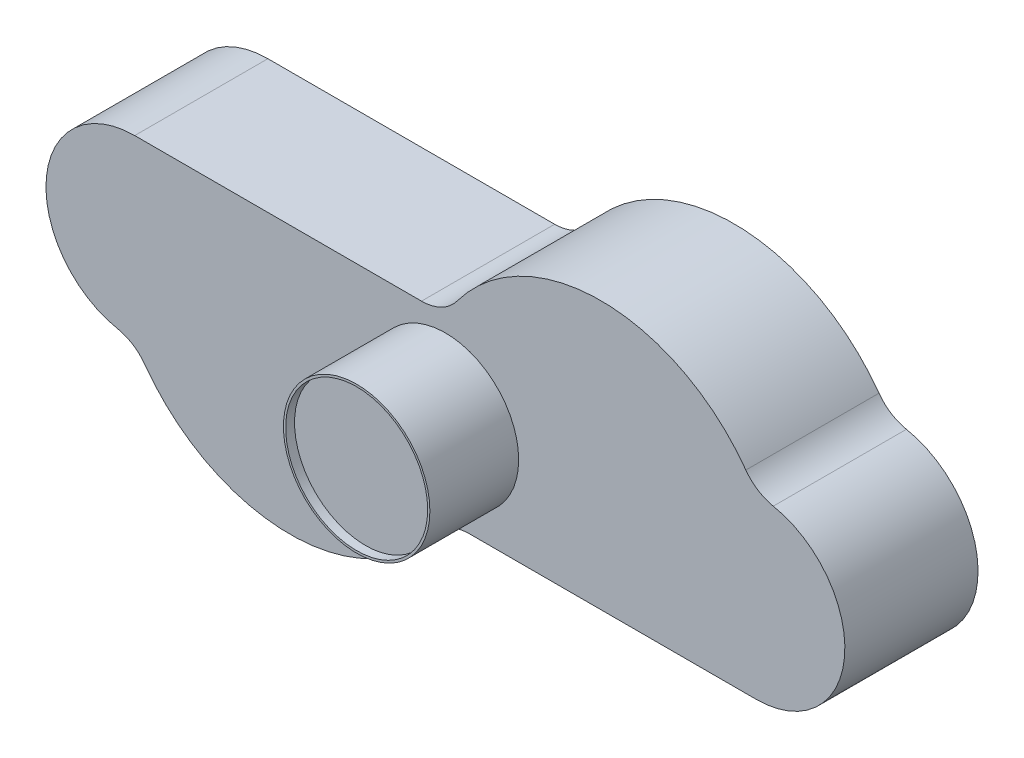
ISO-10303-21;
HEADER;
FILE_DESCRIPTION(('STEP AP214'),'2;1');
FILE_NAME('part.step','',(''),(''),'','','');
FILE_SCHEMA(('AUTOMOTIVE_DESIGN { 1 0 10303 214 1 1 1 1 }'));
ENDSEC;
DATA;
#1=APPLICATION_CONTEXT('core data for automotive mechanical design processes');
#2=APPLICATION_PROTOCOL_DEFINITION('international standard','automotive_design',2000,#1);
#3=PRODUCT_CONTEXT('',#1,'mechanical');
#4=PRODUCT('Part','Part','',(#3));
#5=PRODUCT_RELATED_PRODUCT_CATEGORY('part','',(#4));
#6=PRODUCT_DEFINITION_FORMATION('','',#4);
#7=PRODUCT_DEFINITION_CONTEXT('part definition',#1,'design');
#8=PRODUCT_DEFINITION('design','',#6,#7);
#9=PRODUCT_DEFINITION_SHAPE('','',#8);
#10=(LENGTH_UNIT() NAMED_UNIT(*) SI_UNIT(.MILLI.,.METRE.));
#11=(NAMED_UNIT(*) PLANE_ANGLE_UNIT() SI_UNIT($,.RADIAN.));
#12=(NAMED_UNIT(*) SI_UNIT($,.STERADIAN.) SOLID_ANGLE_UNIT());
#13=UNCERTAINTY_MEASURE_WITH_UNIT(LENGTH_MEASURE(1.E-05),#10,'distance_accuracy_value','');
#14=(GEOMETRIC_REPRESENTATION_CONTEXT(3) GLOBAL_UNCERTAINTY_ASSIGNED_CONTEXT((#13)) GLOBAL_UNIT_ASSIGNED_CONTEXT((#10,
#11,#12)) REPRESENTATION_CONTEXT('',''));
#15=CARTESIAN_POINT('',(0.,0.,0.));
#16=DIRECTION('',(0.,0.,1.));
#17=DIRECTION('',(1.,0.,0.));
#18=AXIS2_PLACEMENT_3D('',#15,#16,#17);
#19=CARTESIAN_POINT('',(35.,-71.8526478134664,15.));
#20=DIRECTION('',(0.,0.,1.));
#21=DIRECTION('',(1.,0.,0.));
#22=AXIS2_PLACEMENT_3D('',#19,#20,#21);
#23=PLANE('',#22);
#24=CARTESIAN_POINT('',(17.5,0.,15.));
#25=DIRECTION('',(0.,0.,1.));
#26=DIRECTION('',(1.,0.,0.));
#27=AXIS2_PLACEMENT_3D('',#24,#25,#26);
#28=CIRCLE('',#27,20.1556443707463);
#29=CARTESIAN_POINT('',(1.15346386464684,-11.791554451199,15.));
#30=VERTEX_POINT('',#29);
#31=CARTESIAN_POINT('',(33.6803638137646,-12.0185617631319,15.));
#32=VERTEX_POINT('',#31);
#33=EDGE_CURVE('E141',#30,#32,#28,.T.);
#34=ORIENTED_EDGE('',*,*,#33,.T.);
#35=CARTESIAN_POINT('',(37.6942180761589,-15.,15.));
#36=DIRECTION('',(0.,0.,1.));
#37=DIRECTION('',(1.,0.,0.));
#38=AXIS2_PLACEMENT_3D('',#35,#36,#37);
#39=CIRCLE('',#38,5.);
#40=CARTESIAN_POINT('',(37.6942180761589,-9.99999999999999,15.));
#41=VERTEX_POINT('',#40);
#42=EDGE_CURVE('E116',#32,#41,#39,.F.);
#43=ORIENTED_EDGE('',*,*,#42,.T.);
#44=DIRECTION('',(1.,0.,0.));
#45=VECTOR('',#44,1.);
#46=CARTESIAN_POINT('',(35.,-9.99999999999999,15.));
#47=LINE('',#46,#45);
#48=CARTESIAN_POINT('',(70.,-9.99999999999999,15.));
#49=VERTEX_POINT('',#48);
#50=EDGE_CURVE('E109',#41,#49,#47,.T.);
#51=ORIENTED_EDGE('',*,*,#50,.T.);
#52=CARTESIAN_POINT('',(70.,0.,15.));
#53=DIRECTION('',(0.,0.,1.));
#54=DIRECTION('',(1.,0.,0.));
#55=AXIS2_PLACEMENT_3D('',#52,#53,#54);
#56=CIRCLE('',#55,10.);
#57=CARTESIAN_POINT('',(71.9344084515707,9.81111940313091,15.));
#58=VERTEX_POINT('',#57);
#59=EDGE_CURVE('E113',#49,#58,#56,.T.);
#60=ORIENTED_EDGE('',*,*,#59,.T.);
#61=CARTESIAN_POINT('',(72.9016126773561,14.7166791046964,15.));
#62=DIRECTION('',(0.,0.,1.));
#63=DIRECTION('',(1.,0.,0.));
#64=AXIS2_PLACEMENT_3D('',#61,#62,#63);
#65=CIRCLE('',#64,5.);
#66=CARTESIAN_POINT('',(68.8465361353532,11.791554451199,15.));
#67=VERTEX_POINT('',#66);
#68=EDGE_CURVE('E168',#58,#67,#65,.F.);
#69=ORIENTED_EDGE('',*,*,#68,.T.);
#70=CARTESIAN_POINT('',(52.5,0.,15.));
#71=DIRECTION('',(0.,0.,1.));
#72=DIRECTION('',(1.,0.,0.));
#73=AXIS2_PLACEMENT_3D('',#70,#71,#72);
#74=CIRCLE('',#73,20.1556443707464);
#75=CARTESIAN_POINT('',(36.3196361862354,12.0185617631319,15.));
#76=VERTEX_POINT('',#75);
#77=EDGE_CURVE('E130',#76,#67,#74,.F.);
#78=ORIENTED_EDGE('',*,*,#77,.F.);
#79=CARTESIAN_POINT('',(32.3057819238411,15.,15.));
#80=DIRECTION('',(0.,0.,1.));
#81=DIRECTION('',(1.,0.,0.));
#82=AXIS2_PLACEMENT_3D('',#79,#80,#81);
#83=CIRCLE('',#82,5.);
#84=CARTESIAN_POINT('',(32.3057819238411,10.,15.));
#85=VERTEX_POINT('',#84);
#86=EDGE_CURVE('E11',#76,#85,#83,.F.);
#87=ORIENTED_EDGE('',*,*,#86,.T.);
#88=DIRECTION('',(1.,0.,0.));
#89=VECTOR('',#88,1.);
#90=CARTESIAN_POINT('',(35.,10.,15.));
#91=LINE('',#90,#89);
#92=CARTESIAN_POINT('',(0.,10.,15.));
#93=VERTEX_POINT('',#92);
#94=EDGE_CURVE('E186',#93,#85,#91,.T.);
#95=ORIENTED_EDGE('',*,*,#94,.F.);
#96=CARTESIAN_POINT('',(0.,0.,15.));
#97=DIRECTION('',(0.,0.,1.));
#98=DIRECTION('',(1.,0.,0.));
#99=AXIS2_PLACEMENT_3D('',#96,#97,#98);
#100=CIRCLE('',#99,10.);
#101=CARTESIAN_POINT('',(-1.93440845157069,-9.81111940313092,15.));
#102=VERTEX_POINT('',#101);
#103=EDGE_CURVE('E189',#93,#102,#100,.T.);
#104=ORIENTED_EDGE('',*,*,#103,.T.);
#105=CARTESIAN_POINT('',(-2.90161267735604,-14.7166791046964,15.));
#106=DIRECTION('',(0.,0.,1.));
#107=DIRECTION('',(1.,0.,0.));
#108=AXIS2_PLACEMENT_3D('',#105,#106,#107);
#109=CIRCLE('',#108,5.);
#110=EDGE_CURVE('E161',#102,#30,#109,.F.);
#111=ORIENTED_EDGE('',*,*,#110,.T.);
#112=EDGE_LOOP('',(#34,#43,#51,#60,#69,#78,#87,#95,#104,#111));
#113=FACE_BOUND('',#112,.T.);
#114=CARTESIAN_POINT('',(35.,0.,15.));
#115=DIRECTION('',(0.,0.,1.));
#116=DIRECTION('',(1.,0.,0.));
#117=AXIS2_PLACEMENT_3D('',#114,#115,#116);
#118=CIRCLE('',#117,8.25);
#119=CARTESIAN_POINT('',(43.25,0.,15.));
#120=VERTEX_POINT('',#119);
#121=EDGE_CURVE('E273',#120,#120,#118,.T.);
#122=ORIENTED_EDGE('',*,*,#121,.F.);
#123=EDGE_LOOP('',(#122));
#124=FACE_BOUND('',#123,.T.);
#125=ADVANCED_FACE('F33',(#113,#124),#23,.T.);
#126=CARTESIAN_POINT('',(35.,-9.99999999999999,15.));
#127=DIRECTION('',(0.,1.,0.));
#128=DIRECTION('',(-1.,0.,0.));
#129=AXIS2_PLACEMENT_3D('',#126,#127,#128);
#130=PLANE('',#129);
#131=ORIENTED_EDGE('',*,*,#50,.F.);
#132=DIRECTION('',(0.,0.,1.));
#133=VECTOR('',#132,1.);
#134=CARTESIAN_POINT('',(37.6942180761589,-9.99999999999999,0.));
#135=LINE('',#134,#133);
#136=CARTESIAN_POINT('',(37.6942180761589,-9.99999999999999,0.));
#137=VERTEX_POINT('',#136);
#138=EDGE_CURVE('E149',#41,#137,#135,.F.);
#139=ORIENTED_EDGE('',*,*,#138,.T.);
#140=DIRECTION('',(1.,0.,0.));
#141=VECTOR('',#140,1.);
#142=CARTESIAN_POINT('',(35.,-9.99999999999999,0.));
#143=LINE('',#142,#141);
#144=CARTESIAN_POINT('',(70.,-9.99999999999999,0.));
#145=VERTEX_POINT('',#144);
#146=EDGE_CURVE('E134',#137,#145,#143,.T.);
#147=ORIENTED_EDGE('',*,*,#146,.T.);
#148=DIRECTION('',(0.,0.,-1.));
#149=VECTOR('',#148,1.);
#150=CARTESIAN_POINT('',(70.,-9.99999999999999,15.));
#151=LINE('',#150,#149);
#152=EDGE_CURVE('E127',#49,#145,#151,.T.);
#153=ORIENTED_EDGE('',*,*,#152,.F.);
#154=EDGE_LOOP('',(#131,#139,#147,#153));
#155=FACE_BOUND('',#154,.T.);
#156=ADVANCED_FACE('F132',(#155),#130,.F.);
#157=CARTESIAN_POINT('',(70.,0.,15.));
#158=DIRECTION('',(0.,0.,-1.));
#159=DIRECTION('',(-1.,0.,0.));
#160=AXIS2_PLACEMENT_3D('',#157,#158,#159);
#161=CYLINDRICAL_SURFACE('',#160,10.);
#162=CARTESIAN_POINT('',(70.,0.,0.));
#163=DIRECTION('',(0.,0.,1.));
#164=DIRECTION('',(1.,0.,0.));
#165=AXIS2_PLACEMENT_3D('',#162,#163,#164);
#166=CIRCLE('',#165,10.);
#167=CARTESIAN_POINT('',(71.9344084515707,9.81111940313091,0.));
#168=VERTEX_POINT('',#167);
#169=EDGE_CURVE('E182',#145,#168,#166,.T.);
#170=ORIENTED_EDGE('',*,*,#169,.T.);
#171=DIRECTION('',(0.,0.,-1.));
#172=VECTOR('',#171,1.);
#173=CARTESIAN_POINT('',(71.9344084515707,9.81111940313091,15.));
#174=LINE('',#173,#172);
#175=EDGE_CURVE('E129',#168,#58,#174,.F.);
#176=ORIENTED_EDGE('',*,*,#175,.T.);
#177=ORIENTED_EDGE('',*,*,#59,.F.);
#178=ORIENTED_EDGE('',*,*,#152,.T.);
#179=EDGE_LOOP('',(#170,#176,#177,#178));
#180=FACE_BOUND('',#179,.T.);
#181=ADVANCED_FACE('F126',(#180),#161,.T.);
#182=CARTESIAN_POINT('',(52.5,0.,15.));
#183=DIRECTION('',(0.,0.,-1.));
#184=DIRECTION('',(-1.,0.,0.));
#185=AXIS2_PLACEMENT_3D('',#182,#183,#184);
#186=CYLINDRICAL_SURFACE('',#185,20.1556443707464);
#187=ORIENTED_EDGE('',*,*,#77,.T.);
#188=DIRECTION('',(0.,0.,-1.));
#189=VECTOR('',#188,1.);
#190=CARTESIAN_POINT('',(68.8465361353532,11.791554451199,15.));
#191=LINE('',#190,#189);
#192=CARTESIAN_POINT('',(68.8465361353532,11.791554451199,0.));
#193=VERTEX_POINT('',#192);
#194=EDGE_CURVE('E153',#67,#193,#191,.T.);
#195=ORIENTED_EDGE('',*,*,#194,.T.);
#196=CARTESIAN_POINT('',(52.5,0.,0.));
#197=DIRECTION('',(0.,0.,1.));
#198=DIRECTION('',(1.,0.,0.));
#199=AXIS2_PLACEMENT_3D('',#196,#197,#198);
#200=CIRCLE('',#199,20.1556443707464);
#201=CARTESIAN_POINT('',(36.3196361862354,12.0185617631319,0.));
#202=VERTEX_POINT('',#201);
#203=EDGE_CURVE('E174',#202,#193,#200,.F.);
#204=ORIENTED_EDGE('',*,*,#203,.F.);
#205=DIRECTION('',(0.,0.,-1.));
#206=VECTOR('',#205,1.);
#207=CARTESIAN_POINT('',(36.3196361862353,12.0185617631319,15.));
#208=LINE('',#207,#206);
#209=EDGE_CURVE('E151',#202,#76,#208,.F.);
#210=ORIENTED_EDGE('',*,*,#209,.T.);
#211=EDGE_LOOP('',(#187,#195,#204,#210));
#212=FACE_BOUND('',#211,.T.);
#213=ADVANCED_FACE('F180',(#212),#186,.T.);
#214=CARTESIAN_POINT('',(35.,10.,15.));
#215=DIRECTION('',(0.,1.,0.));
#216=DIRECTION('',(-1.,0.,0.));
#217=AXIS2_PLACEMENT_3D('',#214,#215,#216);
#218=PLANE('',#217);
#219=ORIENTED_EDGE('',*,*,#94,.T.);
#220=DIRECTION('',(0.,0.,1.));
#221=VECTOR('',#220,1.);
#222=CARTESIAN_POINT('',(32.3057819238411,10.,0.));
#223=LINE('',#222,#221);
#224=CARTESIAN_POINT('',(32.3057819238411,10.,0.));
#225=VERTEX_POINT('',#224);
#226=EDGE_CURVE('E157',#85,#225,#223,.F.);
#227=ORIENTED_EDGE('',*,*,#226,.T.);
#228=DIRECTION('',(1.,0.,0.));
#229=VECTOR('',#228,1.);
#230=CARTESIAN_POINT('',(35.,10.,0.));
#231=LINE('',#230,#229);
#232=CARTESIAN_POINT('',(0.,10.,0.));
#233=VERTEX_POINT('',#232);
#234=EDGE_CURVE('E177',#233,#225,#231,.T.);
#235=ORIENTED_EDGE('',*,*,#234,.F.);
#236=DIRECTION('',(0.,0.,-1.));
#237=VECTOR('',#236,1.);
#238=CARTESIAN_POINT('',(0.,10.,15.));
#239=LINE('',#238,#237);
#240=EDGE_CURVE('E137',#93,#233,#239,.T.);
#241=ORIENTED_EDGE('',*,*,#240,.F.);
#242=EDGE_LOOP('',(#219,#227,#235,#241));
#243=FACE_BOUND('',#242,.T.);
#244=ADVANCED_FACE('F185',(#243),#218,.T.);
#245=CARTESIAN_POINT('',(0.,0.,15.));
#246=DIRECTION('',(0.,0.,-1.));
#247=DIRECTION('',(-1.,0.,0.));
#248=AXIS2_PLACEMENT_3D('',#245,#246,#247);
#249=CYLINDRICAL_SURFACE('',#248,10.);
#250=CARTESIAN_POINT('',(0.,0.,0.));
#251=DIRECTION('',(0.,0.,1.));
#252=DIRECTION('',(1.,0.,0.));
#253=AXIS2_PLACEMENT_3D('',#250,#251,#252);
#254=CIRCLE('',#253,10.);
#255=CARTESIAN_POINT('',(-1.93440845157069,-9.81111940313092,0.));
#256=VERTEX_POINT('',#255);
#257=EDGE_CURVE('E199',#233,#256,#254,.T.);
#258=ORIENTED_EDGE('',*,*,#257,.T.);
#259=DIRECTION('',(0.,0.,-1.));
#260=VECTOR('',#259,1.);
#261=CARTESIAN_POINT('',(-1.93440845157069,-9.81111940313092,15.));
#262=LINE('',#261,#260);
#263=EDGE_CURVE('E147',#256,#102,#262,.F.);
#264=ORIENTED_EDGE('',*,*,#263,.T.);
#265=ORIENTED_EDGE('',*,*,#103,.F.);
#266=ORIENTED_EDGE('',*,*,#240,.T.);
#267=EDGE_LOOP('',(#258,#264,#265,#266));
#268=FACE_BOUND('',#267,.T.);
#269=ADVANCED_FACE('F233',(#268),#249,.T.);
#270=CARTESIAN_POINT('',(17.5,0.,15.));
#271=DIRECTION('',(0.,0.,-1.));
#272=DIRECTION('',(-1.,0.,0.));
#273=AXIS2_PLACEMENT_3D('',#270,#271,#272);
#274=CYLINDRICAL_SURFACE('',#273,20.1556443707463);
#275=ORIENTED_EDGE('',*,*,#33,.F.);
#276=DIRECTION('',(0.,0.,-1.));
#277=VECTOR('',#276,1.);
#278=CARTESIAN_POINT('',(1.15346386464684,-11.791554451199,15.));
#279=LINE('',#278,#277);
#280=CARTESIAN_POINT('',(1.15346386464684,-11.791554451199,0.));
#281=VERTEX_POINT('',#280);
#282=EDGE_CURVE('E139',#30,#281,#279,.T.);
#283=ORIENTED_EDGE('',*,*,#282,.T.);
#284=CARTESIAN_POINT('',(17.5,0.,0.));
#285=DIRECTION('',(0.,0.,1.));
#286=DIRECTION('',(1.,0.,0.));
#287=AXIS2_PLACEMENT_3D('',#284,#285,#286);
#288=CIRCLE('',#287,20.1556443707463);
#289=CARTESIAN_POINT('',(33.6803638137646,-12.0185617631319,0.));
#290=VERTEX_POINT('',#289);
#291=EDGE_CURVE('E121',#281,#290,#288,.T.);
#292=ORIENTED_EDGE('',*,*,#291,.T.);
#293=DIRECTION('',(0.,0.,-1.));
#294=VECTOR('',#293,1.);
#295=CARTESIAN_POINT('',(33.6803638137646,-12.0185617631318,15.));
#296=LINE('',#295,#294);
#297=EDGE_CURVE('E136',#290,#32,#296,.F.);
#298=ORIENTED_EDGE('',*,*,#297,.T.);
#299=EDGE_LOOP('',(#275,#283,#292,#298));
#300=FACE_BOUND('',#299,.T.);
#301=ADVANCED_FACE('F206',(#300),#274,.T.);
#302=CARTESIAN_POINT('',(35.,-71.8526478134664,0.));
#303=DIRECTION('',(0.,0.,1.));
#304=DIRECTION('',(1.,0.,0.));
#305=AXIS2_PLACEMENT_3D('',#302,#303,#304);
#306=PLANE('',#305);
#307=ORIENTED_EDGE('',*,*,#146,.F.);
#308=CARTESIAN_POINT('',(37.6942180761589,-15.,0.));
#309=DIRECTION('',(0.,0.,1.));
#310=DIRECTION('',(1.,0.,0.));
#311=AXIS2_PLACEMENT_3D('',#308,#309,#310);
#312=CIRCLE('',#311,5.);
#313=EDGE_CURVE('E163',#137,#290,#312,.T.);
#314=ORIENTED_EDGE('',*,*,#313,.T.);
#315=ORIENTED_EDGE('',*,*,#291,.F.);
#316=CARTESIAN_POINT('',(-2.90161267735604,-14.7166791046964,0.));
#317=DIRECTION('',(0.,0.,1.));
#318=DIRECTION('',(1.,0.,0.));
#319=AXIS2_PLACEMENT_3D('',#316,#317,#318);
#320=CIRCLE('',#319,5.);
#321=EDGE_CURVE('E159',#281,#256,#320,.T.);
#322=ORIENTED_EDGE('',*,*,#321,.T.);
#323=ORIENTED_EDGE('',*,*,#257,.F.);
#324=ORIENTED_EDGE('',*,*,#234,.T.);
#325=CARTESIAN_POINT('',(32.3057819238411,15.,0.));
#326=DIRECTION('',(0.,0.,1.));
#327=DIRECTION('',(1.,0.,0.));
#328=AXIS2_PLACEMENT_3D('',#325,#326,#327);
#329=CIRCLE('',#328,5.);
#330=EDGE_CURVE('E41',#225,#202,#329,.T.);
#331=ORIENTED_EDGE('',*,*,#330,.T.);
#332=ORIENTED_EDGE('',*,*,#203,.T.);
#333=CARTESIAN_POINT('',(72.9016126773561,14.7166791046964,0.));
#334=DIRECTION('',(0.,0.,1.));
#335=DIRECTION('',(1.,0.,0.));
#336=AXIS2_PLACEMENT_3D('',#333,#334,#335);
#337=CIRCLE('',#336,5.);
#338=EDGE_CURVE('E166',#193,#168,#337,.T.);
#339=ORIENTED_EDGE('',*,*,#338,.T.);
#340=ORIENTED_EDGE('',*,*,#169,.F.);
#341=EDGE_LOOP('',(#307,#314,#315,#322,#323,#324,#331,#332,#339,#340));
#342=FACE_BOUND('',#341,.T.);
#343=ADVANCED_FACE('F173',(#342),#306,.F.);
#344=CARTESIAN_POINT('',(35.,0.,25.));
#345=DIRECTION('',(0.,0.,-1.));
#346=DIRECTION('',(-1.,0.,0.));
#347=AXIS2_PLACEMENT_3D('',#344,#345,#346);
#348=CYLINDRICAL_SURFACE('',#347,8.25);
#349=CARTESIAN_POINT('',(35.,0.,25.));
#350=DIRECTION('',(0.,0.,1.));
#351=DIRECTION('',(1.,0.,0.));
#352=AXIS2_PLACEMENT_3D('',#349,#350,#351);
#353=CIRCLE('',#352,8.25);
#354=CARTESIAN_POINT('',(43.25,0.,25.));
#355=VERTEX_POINT('',#354);
#356=EDGE_CURVE('E196',#355,#355,#353,.T.);
#357=ORIENTED_EDGE('',*,*,#356,.F.);
#358=EDGE_LOOP('',(#357));
#359=FACE_BOUND('',#358,.T.);
#360=ORIENTED_EDGE('',*,*,#121,.T.);
#361=EDGE_LOOP('',(#360));
#362=FACE_BOUND('',#361,.T.);
#363=ADVANCED_FACE('F227',(#359,#362),#348,.T.);
#364=CARTESIAN_POINT('',(35.,0.,25.));
#365=DIRECTION('',(0.,0.,1.));
#366=DIRECTION('',(1.,0.,0.));
#367=AXIS2_PLACEMENT_3D('',#364,#365,#366);
#368=PLANE('',#367);
#369=CARTESIAN_POINT('',(35.,0.,25.));
#370=DIRECTION('',(0.,0.,1.));
#371=DIRECTION('',(1.,0.,0.));
#372=AXIS2_PLACEMENT_3D('',#369,#370,#371);
#373=CIRCLE('',#372,8.);
#374=CARTESIAN_POINT('',(43.,0.,25.));
#375=VERTEX_POINT('',#374);
#376=EDGE_CURVE('E270',#375,#375,#373,.T.);
#377=ORIENTED_EDGE('',*,*,#376,.F.);
#378=EDGE_LOOP('',(#377));
#379=FACE_BOUND('',#378,.T.);
#380=ORIENTED_EDGE('',*,*,#356,.T.);
#381=EDGE_LOOP('',(#380));
#382=FACE_BOUND('',#381,.T.);
#383=ADVANCED_FACE('F257',(#379,#382),#368,.T.);
#384=CARTESIAN_POINT('',(35.,0.,24.));
#385=DIRECTION('',(0.,0.,1.));
#386=DIRECTION('',(1.,0.,0.));
#387=AXIS2_PLACEMENT_3D('',#384,#385,#386);
#388=CYLINDRICAL_SURFACE('',#387,8.);
#389=CARTESIAN_POINT('',(35.,0.,24.));
#390=DIRECTION('',(0.,0.,1.));
#391=DIRECTION('',(1.,0.,0.));
#392=AXIS2_PLACEMENT_3D('',#389,#390,#391);
#393=CIRCLE('',#392,8.);
#394=CARTESIAN_POINT('',(43.,0.,24.));
#395=VERTEX_POINT('',#394);
#396=EDGE_CURVE('E276',#395,#395,#393,.T.);
#397=ORIENTED_EDGE('',*,*,#396,.F.);
#398=EDGE_LOOP('',(#397));
#399=FACE_BOUND('',#398,.T.);
#400=ORIENTED_EDGE('',*,*,#376,.T.);
#401=EDGE_LOOP('',(#400));
#402=FACE_BOUND('',#401,.T.);
#403=ADVANCED_FACE('F249',(#399,#402),#388,.F.);
#404=CARTESIAN_POINT('',(35.,0.,24.));
#405=DIRECTION('',(0.,0.,1.));
#406=DIRECTION('',(1.,0.,0.));
#407=AXIS2_PLACEMENT_3D('',#404,#405,#406);
#408=PLANE('',#407);
#409=ORIENTED_EDGE('',*,*,#396,.T.);
#410=EDGE_LOOP('',(#409));
#411=FACE_BOUND('',#410,.T.);
#412=ADVANCED_FACE('F244',(#411),#408,.T.);
#413=CARTESIAN_POINT('',(-2.90161267735604,-14.7166791046964,15.));
#414=DIRECTION('',(0.,0.,1.));
#415=DIRECTION('',(1.,0.,0.));
#416=AXIS2_PLACEMENT_3D('',#413,#414,#415);
#417=CYLINDRICAL_SURFACE('',#416,5.);
#418=ORIENTED_EDGE('',*,*,#110,.F.);
#419=ORIENTED_EDGE('',*,*,#263,.F.);
#420=ORIENTED_EDGE('',*,*,#321,.F.);
#421=ORIENTED_EDGE('',*,*,#282,.F.);
#422=EDGE_LOOP('',(#418,#419,#420,#421));
#423=FACE_BOUND('',#422,.T.);
#424=ADVANCED_FACE('F217',(#423),#417,.F.);
#425=CARTESIAN_POINT('',(37.6942180761589,-15.,15.));
#426=DIRECTION('',(0.,0.,-1.));
#427=DIRECTION('',(-1.,0.,0.));
#428=AXIS2_PLACEMENT_3D('',#425,#426,#427);
#429=CYLINDRICAL_SURFACE('',#428,5.);
#430=ORIENTED_EDGE('',*,*,#42,.F.);
#431=ORIENTED_EDGE('',*,*,#297,.F.);
#432=ORIENTED_EDGE('',*,*,#313,.F.);
#433=ORIENTED_EDGE('',*,*,#138,.F.);
#434=EDGE_LOOP('',(#430,#431,#432,#433));
#435=FACE_BOUND('',#434,.T.);
#436=ADVANCED_FACE('F209',(#435),#429,.F.);
#437=CARTESIAN_POINT('',(72.9016126773561,14.7166791046964,15.));
#438=DIRECTION('',(0.,0.,1.));
#439=DIRECTION('',(1.,0.,0.));
#440=AXIS2_PLACEMENT_3D('',#437,#438,#439);
#441=CYLINDRICAL_SURFACE('',#440,5.);
#442=ORIENTED_EDGE('',*,*,#68,.F.);
#443=ORIENTED_EDGE('',*,*,#175,.F.);
#444=ORIENTED_EDGE('',*,*,#338,.F.);
#445=ORIENTED_EDGE('',*,*,#194,.F.);
#446=EDGE_LOOP('',(#442,#443,#444,#445));
#447=FACE_BOUND('',#446,.T.);
#448=ADVANCED_FACE('F211',(#447),#441,.F.);
#449=CARTESIAN_POINT('',(32.3057819238411,15.,15.));
#450=DIRECTION('',(0.,0.,-1.));
#451=DIRECTION('',(-1.,0.,0.));
#452=AXIS2_PLACEMENT_3D('',#449,#450,#451);
#453=CYLINDRICAL_SURFACE('',#452,5.);
#454=ORIENTED_EDGE('',*,*,#86,.F.);
#455=ORIENTED_EDGE('',*,*,#209,.F.);
#456=ORIENTED_EDGE('',*,*,#330,.F.);
#457=ORIENTED_EDGE('',*,*,#226,.F.);
#458=EDGE_LOOP('',(#454,#455,#456,#457));
#459=FACE_BOUND('',#458,.T.);
#460=ADVANCED_FACE('F35',(#459),#453,.F.);
#461=CLOSED_SHELL('',(#125,#156,#181,#213,#244,#269,#301,#343,#363,#383,#403,#412,#424,#436,
#448,#460));
#462=MANIFOLD_SOLID_BREP('B2',#461);
#463=ADVANCED_BREP_SHAPE_REPRESENTATION('',(#18,#462),#14);
#464=SHAPE_DEFINITION_REPRESENTATION(#9,#463);
ENDSEC;
END-ISO-10303-21;
